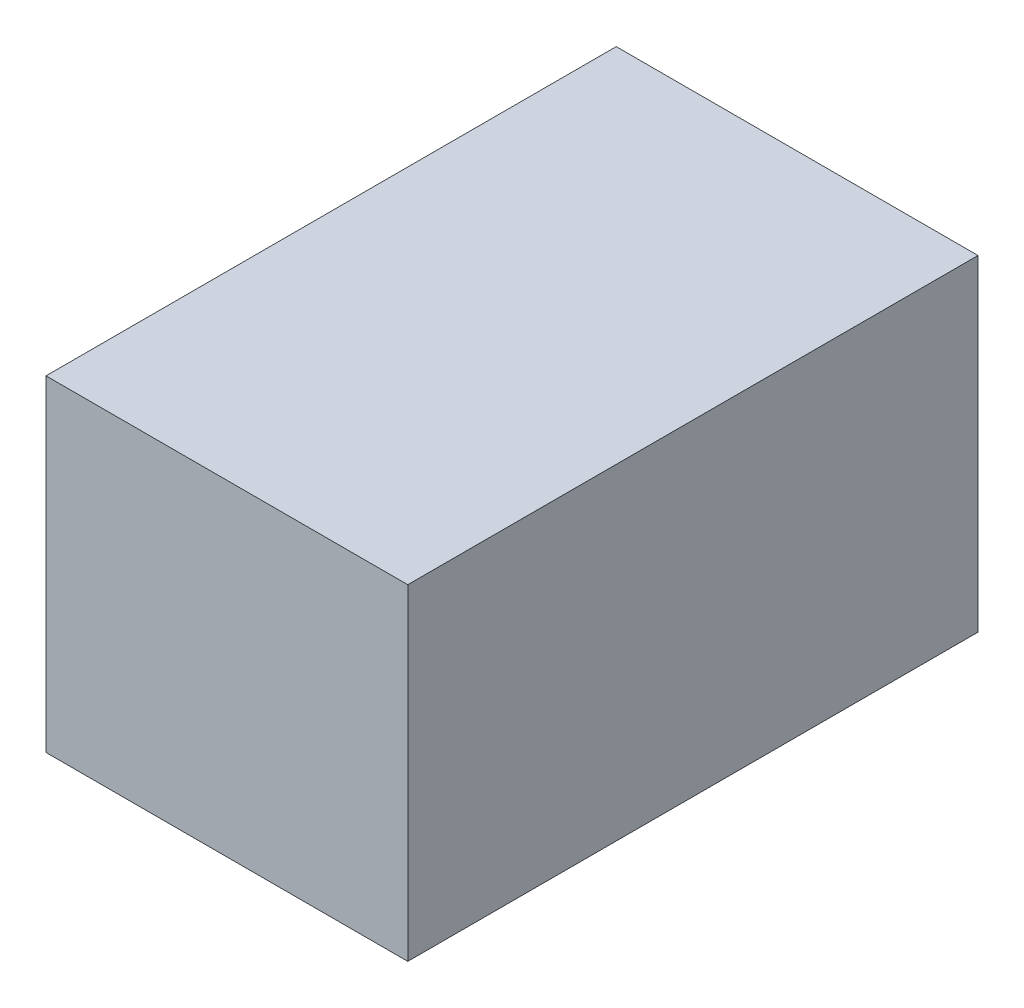
ISO-10303-21;
HEADER;
FILE_DESCRIPTION(('STEP AP214'),'2;1');
FILE_NAME('part.step','',(''),(''),'','','');
FILE_SCHEMA(('AUTOMOTIVE_DESIGN { 1 0 10303 214 1 1 1 1 }'));
ENDSEC;
DATA;
#1=APPLICATION_CONTEXT('core data for automotive mechanical design processes');
#2=APPLICATION_PROTOCOL_DEFINITION('international standard','automotive_design',2000,#1);
#3=PRODUCT_CONTEXT('',#1,'mechanical');
#4=PRODUCT('Part','Part','',(#3));
#5=PRODUCT_RELATED_PRODUCT_CATEGORY('part','',(#4));
#6=PRODUCT_DEFINITION_FORMATION('','',#4);
#7=PRODUCT_DEFINITION_CONTEXT('part definition',#1,'design');
#8=PRODUCT_DEFINITION('design','',#6,#7);
#9=PRODUCT_DEFINITION_SHAPE('','',#8);
#10=(LENGTH_UNIT() NAMED_UNIT(*) SI_UNIT(.MILLI.,.METRE.));
#11=(NAMED_UNIT(*) PLANE_ANGLE_UNIT() SI_UNIT($,.RADIAN.));
#12=(NAMED_UNIT(*) SI_UNIT($,.STERADIAN.) SOLID_ANGLE_UNIT());
#13=UNCERTAINTY_MEASURE_WITH_UNIT(LENGTH_MEASURE(1.E-05),#10,'distance_accuracy_value','');
#14=(GEOMETRIC_REPRESENTATION_CONTEXT(3) GLOBAL_UNCERTAINTY_ASSIGNED_CONTEXT((#13)) GLOBAL_UNIT_ASSIGNED_CONTEXT((#10,
#11,#12)) REPRESENTATION_CONTEXT('',''));
#15=CARTESIAN_POINT('',(0.,0.,0.));
#16=DIRECTION('',(0.,0.,1.));
#17=DIRECTION('',(1.,0.,0.));
#18=AXIS2_PLACEMENT_3D('',#15,#16,#17);
#19=CARTESIAN_POINT('',(0.,10.,0.));
#20=DIRECTION('',(1.,0.,0.));
#21=DIRECTION('',(0.,0.,-1.));
#22=AXIS2_PLACEMENT_3D('',#19,#20,#21);
#23=PLANE('',#22);
#24=DIRECTION('',(0.,0.,1.));
#25=VECTOR('',#24,1.);
#26=CARTESIAN_POINT('',(0.,0.,0.));
#27=LINE('',#26,#25);
#28=CARTESIAN_POINT('',(0.,0.,0.));
#29=VERTEX_POINT('',#28);
#30=CARTESIAN_POINT('',(0.,0.,17.48));
#31=VERTEX_POINT('',#30);
#32=EDGE_CURVE('E113',#29,#31,#27,.T.);
#33=ORIENTED_EDGE('',*,*,#32,.T.);
#34=DIRECTION('',(0.,-1.,0.));
#35=VECTOR('',#34,1.);
#36=CARTESIAN_POINT('',(0.,10.,17.48));
#37=LINE('',#36,#35);
#38=CARTESIAN_POINT('',(0.,10.,17.48));
#39=VERTEX_POINT('',#38);
#40=EDGE_CURVE('E11',#39,#31,#37,.T.);
#41=ORIENTED_EDGE('',*,*,#40,.F.);
#42=DIRECTION('',(0.,0.,1.));
#43=VECTOR('',#42,1.);
#44=CARTESIAN_POINT('',(0.,10.,0.));
#45=LINE('',#44,#43);
#46=CARTESIAN_POINT('',(0.,10.,0.));
#47=VERTEX_POINT('',#46);
#48=EDGE_CURVE('E97',#47,#39,#45,.T.);
#49=ORIENTED_EDGE('',*,*,#48,.F.);
#50=DIRECTION('',(0.,-1.,0.));
#51=VECTOR('',#50,1.);
#52=CARTESIAN_POINT('',(0.,10.,0.));
#53=LINE('',#52,#51);
#54=EDGE_CURVE('E109',#47,#29,#53,.T.);
#55=ORIENTED_EDGE('',*,*,#54,.T.);
#56=EDGE_LOOP('',(#33,#41,#49,#55));
#57=FACE_BOUND('',#56,.T.);
#58=ADVANCED_FACE('F45',(#57),#23,.F.);
#59=CARTESIAN_POINT('',(0.,10.,17.48));
#60=DIRECTION('',(0.,0.,-1.));
#61=DIRECTION('',(-1.,0.,0.));
#62=AXIS2_PLACEMENT_3D('',#59,#60,#61);
#63=PLANE('',#62);
#64=DIRECTION('',(1.,0.,0.));
#65=VECTOR('',#64,1.);
#66=CARTESIAN_POINT('',(0.,0.,17.48));
#67=LINE('',#66,#65);
#68=CARTESIAN_POINT('',(11.09,0.,17.48));
#69=VERTEX_POINT('',#68);
#70=EDGE_CURVE('E102',#31,#69,#67,.T.);
#71=ORIENTED_EDGE('',*,*,#70,.T.);
#72=DIRECTION('',(0.,-1.,0.));
#73=VECTOR('',#72,1.);
#74=CARTESIAN_POINT('',(11.09,10.,17.48));
#75=LINE('',#74,#73);
#76=CARTESIAN_POINT('',(11.09,10.,17.48));
#77=VERTEX_POINT('',#76);
#78=EDGE_CURVE('E54',#77,#69,#75,.T.);
#79=ORIENTED_EDGE('',*,*,#78,.F.);
#80=DIRECTION('',(1.,0.,0.));
#81=VECTOR('',#80,1.);
#82=CARTESIAN_POINT('',(0.,10.,17.48));
#83=LINE('',#82,#81);
#84=EDGE_CURVE('E92',#39,#77,#83,.T.);
#85=ORIENTED_EDGE('',*,*,#84,.F.);
#86=ORIENTED_EDGE('',*,*,#40,.T.);
#87=EDGE_LOOP('',(#71,#79,#85,#86));
#88=FACE_BOUND('',#87,.T.);
#89=ADVANCED_FACE('F101',(#88),#63,.F.);
#90=CARTESIAN_POINT('',(11.09,10.,0.));
#91=DIRECTION('',(-1.,0.,0.));
#92=DIRECTION('',(0.,0.,1.));
#93=AXIS2_PLACEMENT_3D('',#90,#91,#92);
#94=PLANE('',#93);
#95=DIRECTION('',(0.,0.,-1.));
#96=VECTOR('',#95,1.);
#97=CARTESIAN_POINT('',(11.09,0.,0.));
#98=LINE('',#97,#96);
#99=CARTESIAN_POINT('',(11.09,0.,0.));
#100=VERTEX_POINT('',#99);
#101=EDGE_CURVE('E79',#69,#100,#98,.T.);
#102=ORIENTED_EDGE('',*,*,#101,.T.);
#103=DIRECTION('',(0.,-1.,0.));
#104=VECTOR('',#103,1.);
#105=CARTESIAN_POINT('',(11.09,10.,0.));
#106=LINE('',#105,#104);
#107=CARTESIAN_POINT('',(11.09,10.,0.));
#108=VERTEX_POINT('',#107);
#109=EDGE_CURVE('E104',#108,#100,#106,.T.);
#110=ORIENTED_EDGE('',*,*,#109,.F.);
#111=DIRECTION('',(0.,0.,-1.));
#112=VECTOR('',#111,1.);
#113=CARTESIAN_POINT('',(11.09,10.,0.));
#114=LINE('',#113,#112);
#115=EDGE_CURVE('E95',#77,#108,#114,.T.);
#116=ORIENTED_EDGE('',*,*,#115,.F.);
#117=ORIENTED_EDGE('',*,*,#78,.T.);
#118=EDGE_LOOP('',(#102,#110,#116,#117));
#119=FACE_BOUND('',#118,.T.);
#120=ADVANCED_FACE('F105',(#119),#94,.F.);
#121=CARTESIAN_POINT('',(0.,10.,0.));
#122=DIRECTION('',(0.,0.,1.));
#123=DIRECTION('',(1.,0.,0.));
#124=AXIS2_PLACEMENT_3D('',#121,#122,#123);
#125=PLANE('',#124);
#126=DIRECTION('',(-1.,0.,0.));
#127=VECTOR('',#126,1.);
#128=CARTESIAN_POINT('',(0.,0.,0.));
#129=LINE('',#128,#127);
#130=EDGE_CURVE('E85',#100,#29,#129,.T.);
#131=ORIENTED_EDGE('',*,*,#130,.T.);
#132=ORIENTED_EDGE('',*,*,#54,.F.);
#133=DIRECTION('',(-1.,0.,0.));
#134=VECTOR('',#133,1.);
#135=CARTESIAN_POINT('',(0.,10.,0.));
#136=LINE('',#135,#134);
#137=EDGE_CURVE('E62',#108,#47,#136,.T.);
#138=ORIENTED_EDGE('',*,*,#137,.F.);
#139=ORIENTED_EDGE('',*,*,#109,.T.);
#140=EDGE_LOOP('',(#131,#132,#138,#139));
#141=FACE_BOUND('',#140,.T.);
#142=ADVANCED_FACE('F126',(#141),#125,.F.);
#143=CARTESIAN_POINT('',(0.,10.,0.));
#144=DIRECTION('',(0.,1.,0.));
#145=DIRECTION('',(0.,0.,1.));
#146=AXIS2_PLACEMENT_3D('',#143,#144,#145);
#147=PLANE('',#146);
#148=ORIENTED_EDGE('',*,*,#48,.T.);
#149=ORIENTED_EDGE('',*,*,#84,.T.);
#150=ORIENTED_EDGE('',*,*,#115,.T.);
#151=ORIENTED_EDGE('',*,*,#137,.T.);
#152=EDGE_LOOP('',(#148,#149,#150,#151));
#153=FACE_BOUND('',#152,.T.);
#154=ADVANCED_FACE('F93',(#153),#147,.T.);
#155=CARTESIAN_POINT('',(0.,0.,0.));
#156=DIRECTION('',(0.,1.,0.));
#157=DIRECTION('',(0.,0.,1.));
#158=AXIS2_PLACEMENT_3D('',#155,#156,#157);
#159=PLANE('',#158);
#160=ORIENTED_EDGE('',*,*,#32,.F.);
#161=ORIENTED_EDGE('',*,*,#130,.F.);
#162=ORIENTED_EDGE('',*,*,#101,.F.);
#163=ORIENTED_EDGE('',*,*,#70,.F.);
#164=EDGE_LOOP('',(#160,#161,#162,#163));
#165=FACE_BOUND('',#164,.T.);
#166=ADVANCED_FACE('F129',(#165),#159,.F.);
#167=CLOSED_SHELL('',(#58,#89,#120,#142,#154,#166));
#168=MANIFOLD_SOLID_BREP('B2',#167);
#169=ADVANCED_BREP_SHAPE_REPRESENTATION('',(#18,#168),#14);
#170=SHAPE_DEFINITION_REPRESENTATION(#9,#169);
ENDSEC;
END-ISO-10303-21;
